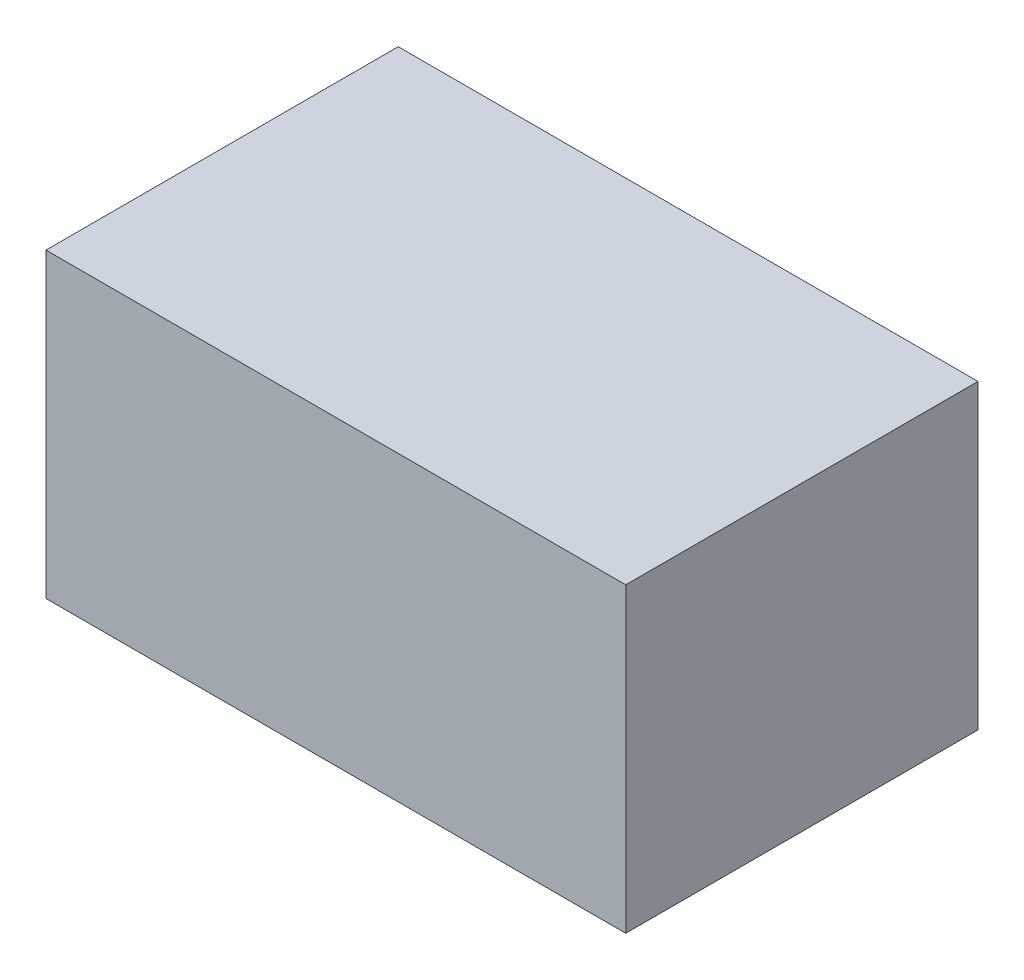
ISO-10303-21;
HEADER;
FILE_DESCRIPTION(('STEP AP214'),'2;1');
FILE_NAME('part.step','',(''),(''),'','','');
FILE_SCHEMA(('AUTOMOTIVE_DESIGN { 1 0 10303 214 1 1 1 1 }'));
ENDSEC;
DATA;
#1=APPLICATION_CONTEXT('core data for automotive mechanical design processes');
#2=APPLICATION_PROTOCOL_DEFINITION('international standard','automotive_design',2000,#1);
#3=PRODUCT_CONTEXT('',#1,'mechanical');
#4=PRODUCT('Part','Part','',(#3));
#5=PRODUCT_RELATED_PRODUCT_CATEGORY('part','',(#4));
#6=PRODUCT_DEFINITION_FORMATION('','',#4);
#7=PRODUCT_DEFINITION_CONTEXT('part definition',#1,'design');
#8=PRODUCT_DEFINITION('design','',#6,#7);
#9=PRODUCT_DEFINITION_SHAPE('','',#8);
#10=(LENGTH_UNIT() NAMED_UNIT(*) SI_UNIT(.MILLI.,.METRE.));
#11=(NAMED_UNIT(*) PLANE_ANGLE_UNIT() SI_UNIT($,.RADIAN.));
#12=(NAMED_UNIT(*) SI_UNIT($,.STERADIAN.) SOLID_ANGLE_UNIT());
#13=UNCERTAINTY_MEASURE_WITH_UNIT(LENGTH_MEASURE(1.E-05),#10,'distance_accuracy_value','');
#14=(GEOMETRIC_REPRESENTATION_CONTEXT(3) GLOBAL_UNCERTAINTY_ASSIGNED_CONTEXT((#13)) GLOBAL_UNIT_ASSIGNED_CONTEXT((#10,
#11,#12)) REPRESENTATION_CONTEXT('',''));
#15=CARTESIAN_POINT('',(0.,0.,0.));
#16=DIRECTION('',(0.,0.,1.));
#17=DIRECTION('',(1.,0.,0.));
#18=AXIS2_PLACEMENT_3D('',#15,#16,#17);
#19=CARTESIAN_POINT('',(72.0077669902914,36.238864887601,56.25));
#20=DIRECTION('',(-1.,0.,0.));
#21=DIRECTION('',(0.,0.,1.));
#22=AXIS2_PLACEMENT_3D('',#19,#20,#21);
#23=PLANE('',#22);
#24=DIRECTION('',(0.,1.,0.));
#25=VECTOR('',#24,1.);
#26=CARTESIAN_POINT('',(72.0077669902914,36.238864887601,-31.25));
#27=LINE('',#26,#25);
#28=CARTESIAN_POINT('',(72.0077669902914,-38.7281254036611,-31.25));
#29=VERTEX_POINT('',#28);
#30=CARTESIAN_POINT('',(72.0077669902914,36.238864887601,-31.25));
#31=VERTEX_POINT('',#30);
#32=EDGE_CURVE('E105',#29,#31,#27,.T.);
#33=ORIENTED_EDGE('',*,*,#32,.T.);
#34=DIRECTION('',(0.,0.,-1.));
#35=VECTOR('',#34,1.);
#36=CARTESIAN_POINT('',(72.0077669902914,36.238864887601,56.25));
#37=LINE('',#36,#35);
#38=CARTESIAN_POINT('',(72.0077669902914,36.238864887601,56.25));
#39=VERTEX_POINT('',#38);
#40=EDGE_CURVE('E11',#39,#31,#37,.T.);
#41=ORIENTED_EDGE('',*,*,#40,.F.);
#42=DIRECTION('',(0.,1.,0.));
#43=VECTOR('',#42,1.);
#44=CARTESIAN_POINT('',(72.0077669902914,36.238864887601,56.25));
#45=LINE('',#44,#43);
#46=CARTESIAN_POINT('',(72.0077669902914,-38.7281254036611,56.25));
#47=VERTEX_POINT('',#46);
#48=EDGE_CURVE('E93',#47,#39,#45,.T.);
#49=ORIENTED_EDGE('',*,*,#48,.F.);
#50=DIRECTION('',(0.,0.,-1.));
#51=VECTOR('',#50,1.);
#52=CARTESIAN_POINT('',(72.0077669902914,-38.7281254036611,56.25));
#53=LINE('',#52,#51);
#54=EDGE_CURVE('E101',#47,#29,#53,.T.);
#55=ORIENTED_EDGE('',*,*,#54,.T.);
#56=EDGE_LOOP('',(#33,#41,#49,#55));
#57=FACE_BOUND('',#56,.T.);
#58=ADVANCED_FACE('F42',(#57),#23,.F.);
#59=CARTESIAN_POINT('',(-72.0077669902914,36.238864887601,56.25));
#60=DIRECTION('',(0.,-1.,0.));
#61=DIRECTION('',(0.,0.,-1.));
#62=AXIS2_PLACEMENT_3D('',#59,#60,#61);
#63=PLANE('',#62);
#64=DIRECTION('',(-1.,0.,0.));
#65=VECTOR('',#64,1.);
#66=CARTESIAN_POINT('',(-72.0077669902914,36.238864887601,-31.25));
#67=LINE('',#66,#65);
#68=CARTESIAN_POINT('',(-72.0077669902914,36.238864887601,-31.25));
#69=VERTEX_POINT('',#68);
#70=EDGE_CURVE('E97',#31,#69,#67,.T.);
#71=ORIENTED_EDGE('',*,*,#70,.T.);
#72=DIRECTION('',(0.,0.,-1.));
#73=VECTOR('',#72,1.);
#74=CARTESIAN_POINT('',(-72.0077669902914,36.238864887601,56.25));
#75=LINE('',#74,#73);
#76=CARTESIAN_POINT('',(-72.0077669902914,36.238864887601,56.25));
#77=VERTEX_POINT('',#76);
#78=EDGE_CURVE('E50',#77,#69,#75,.T.);
#79=ORIENTED_EDGE('',*,*,#78,.F.);
#80=DIRECTION('',(-1.,0.,0.));
#81=VECTOR('',#80,1.);
#82=CARTESIAN_POINT('',(-72.0077669902914,36.238864887601,56.25));
#83=LINE('',#82,#81);
#84=EDGE_CURVE('E88',#39,#77,#83,.T.);
#85=ORIENTED_EDGE('',*,*,#84,.F.);
#86=ORIENTED_EDGE('',*,*,#40,.T.);
#87=EDGE_LOOP('',(#71,#79,#85,#86));
#88=FACE_BOUND('',#87,.T.);
#89=ADVANCED_FACE('F96',(#88),#63,.F.);
#90=CARTESIAN_POINT('',(-72.0077669902914,36.238864887601,56.25));
#91=DIRECTION('',(1.,0.,0.));
#92=DIRECTION('',(0.,0.,-1.));
#93=AXIS2_PLACEMENT_3D('',#90,#91,#92);
#94=PLANE('',#93);
#95=DIRECTION('',(0.,-1.,0.));
#96=VECTOR('',#95,1.);
#97=CARTESIAN_POINT('',(-72.0077669902914,36.238864887601,-31.25));
#98=LINE('',#97,#96);
#99=CARTESIAN_POINT('',(-72.0077669902914,-38.7281254036611,-31.25));
#100=VERTEX_POINT('',#99);
#101=EDGE_CURVE('E75',#69,#100,#98,.T.);
#102=ORIENTED_EDGE('',*,*,#101,.T.);
#103=DIRECTION('',(0.,0.,-1.));
#104=VECTOR('',#103,1.);
#105=CARTESIAN_POINT('',(-72.0077669902914,-38.7281254036611,56.25));
#106=LINE('',#105,#104);
#107=CARTESIAN_POINT('',(-72.0077669902914,-38.7281254036611,56.25));
#108=VERTEX_POINT('',#107);
#109=EDGE_CURVE('E98',#108,#100,#106,.T.);
#110=ORIENTED_EDGE('',*,*,#109,.F.);
#111=DIRECTION('',(0.,-1.,0.));
#112=VECTOR('',#111,1.);
#113=CARTESIAN_POINT('',(-72.0077669902914,36.238864887601,56.25));
#114=LINE('',#113,#112);
#115=EDGE_CURVE('E91',#77,#108,#114,.T.);
#116=ORIENTED_EDGE('',*,*,#115,.F.);
#117=ORIENTED_EDGE('',*,*,#78,.T.);
#118=EDGE_LOOP('',(#102,#110,#116,#117));
#119=FACE_BOUND('',#118,.T.);
#120=ADVANCED_FACE('F99',(#119),#94,.F.);
#121=CARTESIAN_POINT('',(-72.0077669902914,-38.7281254036611,56.25));
#122=DIRECTION('',(0.,1.,0.));
#123=DIRECTION('',(0.,0.,1.));
#124=AXIS2_PLACEMENT_3D('',#121,#122,#123);
#125=PLANE('',#124);
#126=CARTESIAN_POINT('',(0.,-38.7281254036611,12.5));
#127=DIRECTION('',(0.,-1.,0.));
#128=DIRECTION('',(0.,0.,-1.));
#129=AXIS2_PLACEMENT_3D('',#126,#127,#128);
#130=CIRCLE('',#129,26.25);
#131=CARTESIAN_POINT('',(0.,-38.7281254036611,-13.75));
#132=VERTEX_POINT('',#131);
#133=EDGE_CURVE('E119',#132,#132,#130,.T.);
#134=ORIENTED_EDGE('',*,*,#133,.F.);
#135=EDGE_LOOP('',(#134));
#136=FACE_BOUND('',#135,.T.);
#137=DIRECTION('',(1.,0.,0.));
#138=VECTOR('',#137,1.);
#139=CARTESIAN_POINT('',(-72.0077669902914,-38.7281254036611,-31.25));
#140=LINE('',#139,#138);
#141=EDGE_CURVE('E81',#100,#29,#140,.T.);
#142=ORIENTED_EDGE('',*,*,#141,.T.);
#143=ORIENTED_EDGE('',*,*,#54,.F.);
#144=DIRECTION('',(1.,0.,0.));
#145=VECTOR('',#144,1.);
#146=CARTESIAN_POINT('',(-72.0077669902914,-38.7281254036611,56.25));
#147=LINE('',#146,#145);
#148=EDGE_CURVE('E58',#108,#47,#147,.T.);
#149=ORIENTED_EDGE('',*,*,#148,.F.);
#150=ORIENTED_EDGE('',*,*,#109,.T.);
#151=EDGE_LOOP('',(#142,#143,#149,#150));
#152=FACE_BOUND('',#151,.T.);
#153=ADVANCED_FACE('F113',(#136,#152),#125,.F.);
#154=CARTESIAN_POINT('',(0.,-1.24463025803009,56.25));
#155=DIRECTION('',(0.,0.,1.));
#156=DIRECTION('',(1.,0.,0.));
#157=AXIS2_PLACEMENT_3D('',#154,#155,#156);
#158=PLANE('',#157);
#159=ORIENTED_EDGE('',*,*,#48,.T.);
#160=ORIENTED_EDGE('',*,*,#84,.T.);
#161=ORIENTED_EDGE('',*,*,#115,.T.);
#162=ORIENTED_EDGE('',*,*,#148,.T.);
#163=EDGE_LOOP('',(#159,#160,#161,#162));
#164=FACE_BOUND('',#163,.T.);
#165=ADVANCED_FACE('F89',(#164),#158,.T.);
#166=CARTESIAN_POINT('',(0.,-1.24463025803009,-31.25));
#167=DIRECTION('',(0.,0.,1.));
#168=DIRECTION('',(1.,0.,0.));
#169=AXIS2_PLACEMENT_3D('',#166,#167,#168);
#170=PLANE('',#169);
#171=ORIENTED_EDGE('',*,*,#32,.F.);
#172=ORIENTED_EDGE('',*,*,#141,.F.);
#173=ORIENTED_EDGE('',*,*,#101,.F.);
#174=ORIENTED_EDGE('',*,*,#70,.F.);
#175=EDGE_LOOP('',(#171,#172,#173,#174));
#176=FACE_BOUND('',#175,.T.);
#177=ADVANCED_FACE('F116',(#176),#170,.F.);
#178=CARTESIAN_POINT('',(0.,-3.72812540366121,12.5));
#179=DIRECTION('',(0.,-1.,0.));
#180=DIRECTION('',(0.,0.,-1.));
#181=AXIS2_PLACEMENT_3D('',#178,#179,#180);
#182=CYLINDRICAL_SURFACE('',#181,26.25);
#183=CARTESIAN_POINT('',(0.,-3.72812540366121,12.5));
#184=DIRECTION('',(0.,-1.,0.));
#185=DIRECTION('',(0.,0.,-1.));
#186=AXIS2_PLACEMENT_3D('',#183,#184,#185);
#187=CIRCLE('',#186,26.25);
#188=CARTESIAN_POINT('',(0.,-3.72812540366121,-13.75));
#189=VERTEX_POINT('',#188);
#190=EDGE_CURVE('E108',#189,#189,#187,.T.);
#191=ORIENTED_EDGE('',*,*,#190,.F.);
#192=EDGE_LOOP('',(#191));
#193=FACE_BOUND('',#192,.T.);
#194=ORIENTED_EDGE('',*,*,#133,.T.);
#195=EDGE_LOOP('',(#194));
#196=FACE_BOUND('',#195,.T.);
#197=ADVANCED_FACE('F127',(#193,#196),#182,.F.);
#198=CARTESIAN_POINT('',(0.,-3.72812540366121,12.5));
#199=DIRECTION('',(0.,-1.,0.));
#200=DIRECTION('',(0.,0.,-1.));
#201=AXIS2_PLACEMENT_3D('',#198,#199,#200);
#202=PLANE('',#201);
#203=ORIENTED_EDGE('',*,*,#190,.T.);
#204=EDGE_LOOP('',(#203));
#205=FACE_BOUND('',#204,.T.);
#206=ADVANCED_FACE('F125',(#205),#202,.T.);
#207=CLOSED_SHELL('',(#58,#89,#120,#153,#165,#177,#197,#206));
#208=MANIFOLD_SOLID_BREP('B2',#207);
#209=ADVANCED_BREP_SHAPE_REPRESENTATION('',(#18,#208),#14);
#210=SHAPE_DEFINITION_REPRESENTATION(#9,#209);
ENDSEC;
END-ISO-10303-21;
